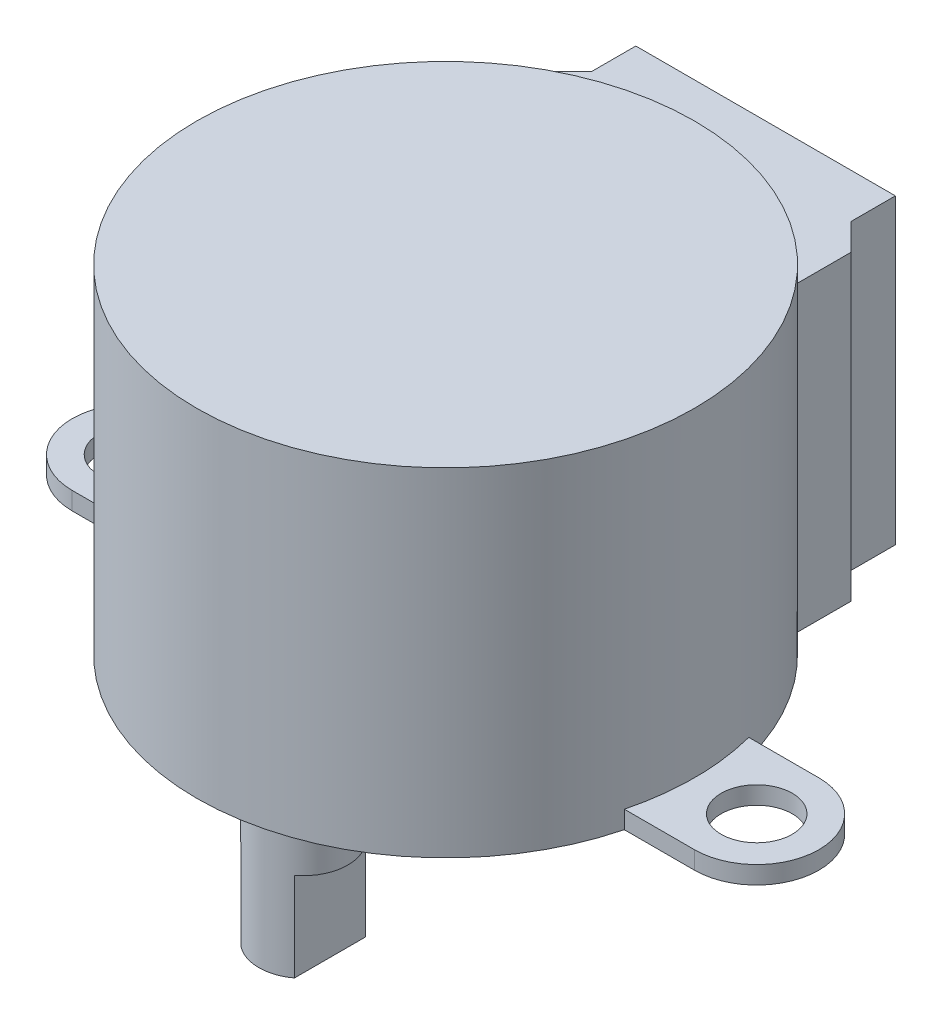
ISO-10303-21;
HEADER;
FILE_DESCRIPTION(('STEP AP214'),'2;1');
FILE_NAME('part.step','',(''),(''),'','','');
FILE_SCHEMA(('AUTOMOTIVE_DESIGN { 1 0 10303 214 1 1 1 1 }'));
ENDSEC;
DATA;
#1=APPLICATION_CONTEXT('core data for automotive mechanical design processes');
#2=APPLICATION_PROTOCOL_DEFINITION('international standard','automotive_design',2000,#1);
#3=PRODUCT_CONTEXT('',#1,'mechanical');
#4=PRODUCT('Part','Part','',(#3));
#5=PRODUCT_RELATED_PRODUCT_CATEGORY('part','',(#4));
#6=PRODUCT_DEFINITION_FORMATION('','',#4);
#7=PRODUCT_DEFINITION_CONTEXT('part definition',#1,'design');
#8=PRODUCT_DEFINITION('design','',#6,#7);
#9=PRODUCT_DEFINITION_SHAPE('','',#8);
#10=(LENGTH_UNIT() NAMED_UNIT(*) SI_UNIT(.MILLI.,.METRE.));
#11=(NAMED_UNIT(*) PLANE_ANGLE_UNIT() SI_UNIT($,.RADIAN.));
#12=(NAMED_UNIT(*) SI_UNIT($,.STERADIAN.) SOLID_ANGLE_UNIT());
#13=UNCERTAINTY_MEASURE_WITH_UNIT(LENGTH_MEASURE(1.E-05),#10,'distance_accuracy_value','');
#14=(GEOMETRIC_REPRESENTATION_CONTEXT(3) GLOBAL_UNCERTAINTY_ASSIGNED_CONTEXT((#13)) GLOBAL_UNIT_ASSIGNED_CONTEXT((#10,
#11,#12)) REPRESENTATION_CONTEXT('',''));
#15=CARTESIAN_POINT('',(0.,0.,0.));
#16=DIRECTION('',(0.,0.,1.));
#17=DIRECTION('',(1.,0.,0.));
#18=AXIS2_PLACEMENT_3D('',#15,#16,#17);
#19=CARTESIAN_POINT('',(0.,-10.,8.));
#20=DIRECTION('',(0.,-1.,0.));
#21=DIRECTION('',(0.,0.,-1.));
#22=AXIS2_PLACEMENT_3D('',#19,#20,#21);
#23=PLANE('',#22);
#24=DIRECTION('',(0.,0.,1.));
#25=VECTOR('',#24,1.);
#26=CARTESIAN_POINT('',(1.5,-10.,10.));
#27=LINE('',#26,#25);
#28=CARTESIAN_POINT('',(1.5,-10.,6.));
#29=VERTEX_POINT('',#28);
#30=CARTESIAN_POINT('',(1.5,-10.,10.));
#31=VERTEX_POINT('',#30);
#32=EDGE_CURVE('E125',#29,#31,#27,.T.);
#33=ORIENTED_EDGE('',*,*,#32,.T.);
#34=CARTESIAN_POINT('',(0.,-10.,8.));
#35=DIRECTION('',(0.,1.,0.));
#36=DIRECTION('',(0.,0.,1.));
#37=AXIS2_PLACEMENT_3D('',#34,#35,#36);
#38=CIRCLE('',#37,2.5);
#39=CARTESIAN_POINT('',(-1.5,-10.,10.));
#40=VERTEX_POINT('',#39);
#41=EDGE_CURVE('E133',#31,#40,#38,.F.);
#42=ORIENTED_EDGE('',*,*,#41,.T.);
#43=DIRECTION('',(0.,0.,-1.));
#44=VECTOR('',#43,1.);
#45=CARTESIAN_POINT('',(-1.5,-10.,10.));
#46=LINE('',#45,#44);
#47=CARTESIAN_POINT('',(-1.5,-10.,6.));
#48=VERTEX_POINT('',#47);
#49=EDGE_CURVE('E128',#40,#48,#46,.T.);
#50=ORIENTED_EDGE('',*,*,#49,.T.);
#51=CARTESIAN_POINT('',(0.,-10.,8.));
#52=DIRECTION('',(0.,1.,0.));
#53=DIRECTION('',(0.,0.,1.));
#54=AXIS2_PLACEMENT_3D('',#51,#52,#53);
#55=CIRCLE('',#54,2.5);
#56=EDGE_CURVE('E19',#48,#29,#55,.F.);
#57=ORIENTED_EDGE('',*,*,#56,.T.);
#58=EDGE_LOOP('',(#33,#42,#50,#57));
#59=FACE_BOUND('',#58,.T.);
#60=ADVANCED_FACE('F16',(#59),#23,.T.);
#61=CARTESIAN_POINT('',(0.,-5.,8.));
#62=DIRECTION('',(0.,-1.,0.));
#63=DIRECTION('',(0.,0.,-1.));
#64=AXIS2_PLACEMENT_3D('',#61,#62,#63);
#65=PLANE('',#64);
#66=CARTESIAN_POINT('',(0.,-5.,8.));
#67=DIRECTION('',(0.,1.,0.));
#68=DIRECTION('',(0.,0.,1.));
#69=AXIS2_PLACEMENT_3D('',#66,#67,#68);
#70=CIRCLE('',#69,2.5);
#71=CARTESIAN_POINT('',(-1.5,-5.,6.));
#72=VERTEX_POINT('',#71);
#73=CARTESIAN_POINT('',(-1.5,-5.,10.));
#74=VERTEX_POINT('',#73);
#75=EDGE_CURVE('E157',#72,#74,#70,.T.);
#76=ORIENTED_EDGE('',*,*,#75,.F.);
#77=DIRECTION('',(0.,0.,-1.));
#78=VECTOR('',#77,1.);
#79=CARTESIAN_POINT('',(-1.5,-5.,10.));
#80=LINE('',#79,#78);
#81=EDGE_CURVE('E158',#72,#74,#80,.F.);
#82=ORIENTED_EDGE('',*,*,#81,.T.);
#83=EDGE_LOOP('',(#76,#82));
#84=FACE_BOUND('',#83,.T.);
#85=ADVANCED_FACE('F224',(#84),#65,.T.);
#86=CARTESIAN_POINT('',(-1.5,-5.,10.));
#87=DIRECTION('',(1.,0.,0.));
#88=DIRECTION('',(0.,0.,-1.));
#89=AXIS2_PLACEMENT_3D('',#86,#87,#88);
#90=PLANE('',#89);
#91=DIRECTION('',(0.,1.,0.));
#92=VECTOR('',#91,1.);
#93=CARTESIAN_POINT('',(-1.5,-10.,10.));
#94=LINE('',#93,#92);
#95=EDGE_CURVE('E161',#74,#40,#94,.F.);
#96=ORIENTED_EDGE('',*,*,#95,.F.);
#97=ORIENTED_EDGE('',*,*,#81,.F.);
#98=DIRECTION('',(0.,1.,0.));
#99=VECTOR('',#98,1.);
#100=CARTESIAN_POINT('',(-1.5,-10.,6.));
#101=LINE('',#100,#99);
#102=EDGE_CURVE('E140',#48,#72,#101,.T.);
#103=ORIENTED_EDGE('',*,*,#102,.F.);
#104=ORIENTED_EDGE('',*,*,#49,.F.);
#105=EDGE_LOOP('',(#96,#97,#103,#104));
#106=FACE_BOUND('',#105,.T.);
#107=ADVANCED_FACE('F221',(#106),#90,.F.);
#108=CARTESIAN_POINT('',(0.,-5.,8.));
#109=DIRECTION('',(0.,-1.,0.));
#110=DIRECTION('',(0.,0.,-1.));
#111=AXIS2_PLACEMENT_3D('',#108,#109,#110);
#112=PLANE('',#111);
#113=CARTESIAN_POINT('',(0.,-5.,8.));
#114=DIRECTION('',(0.,1.,0.));
#115=DIRECTION('',(0.,0.,1.));
#116=AXIS2_PLACEMENT_3D('',#113,#114,#115);
#117=CIRCLE('',#116,2.5);
#118=CARTESIAN_POINT('',(1.5,-5.,10.));
#119=VERTEX_POINT('',#118);
#120=CARTESIAN_POINT('',(1.5,-5.,6.));
#121=VERTEX_POINT('',#120);
#122=EDGE_CURVE('E145',#119,#121,#117,.T.);
#123=ORIENTED_EDGE('',*,*,#122,.F.);
#124=DIRECTION('',(0.,0.,1.));
#125=VECTOR('',#124,1.);
#126=CARTESIAN_POINT('',(1.5,-5.,10.));
#127=LINE('',#126,#125);
#128=EDGE_CURVE('E141',#119,#121,#127,.F.);
#129=ORIENTED_EDGE('',*,*,#128,.T.);
#130=EDGE_LOOP('',(#123,#129));
#131=FACE_BOUND('',#130,.T.);
#132=ADVANCED_FACE('F231',(#131),#112,.T.);
#133=CARTESIAN_POINT('',(1.5,-5.,10.));
#134=DIRECTION('',(-1.,0.,0.));
#135=DIRECTION('',(0.,0.,1.));
#136=AXIS2_PLACEMENT_3D('',#133,#134,#135);
#137=PLANE('',#136);
#138=DIRECTION('',(0.,1.,0.));
#139=VECTOR('',#138,1.);
#140=CARTESIAN_POINT('',(1.5,-10.,6.));
#141=LINE('',#140,#139);
#142=EDGE_CURVE('E137',#121,#29,#141,.F.);
#143=ORIENTED_EDGE('',*,*,#142,.F.);
#144=ORIENTED_EDGE('',*,*,#128,.F.);
#145=DIRECTION('',(0.,1.,0.));
#146=VECTOR('',#145,1.);
#147=CARTESIAN_POINT('',(1.5,-10.,10.));
#148=LINE('',#147,#146);
#149=EDGE_CURVE('E139',#31,#119,#148,.T.);
#150=ORIENTED_EDGE('',*,*,#149,.F.);
#151=ORIENTED_EDGE('',*,*,#32,.F.);
#152=EDGE_LOOP('',(#143,#144,#150,#151));
#153=FACE_BOUND('',#152,.T.);
#154=ADVANCED_FACE('F136',(#153),#137,.F.);
#155=CARTESIAN_POINT('',(0.,-10.,8.));
#156=DIRECTION('',(0.,1.,0.));
#157=DIRECTION('',(0.,0.,1.));
#158=AXIS2_PLACEMENT_3D('',#155,#156,#157);
#159=CYLINDRICAL_SURFACE('',#158,2.5);
#160=CARTESIAN_POINT('',(0.,-1.6,8.));
#161=DIRECTION('',(0.,1.,0.));
#162=DIRECTION('',(0.,0.,1.));
#163=AXIS2_PLACEMENT_3D('',#160,#161,#162);
#164=CIRCLE('',#163,2.5);
#165=CARTESIAN_POINT('',(0.,-1.6,10.5));
#166=VERTEX_POINT('',#165);
#167=EDGE_CURVE('E147',#166,#166,#164,.T.);
#168=ORIENTED_EDGE('',*,*,#167,.F.);
#169=EDGE_LOOP('',(#168));
#170=FACE_BOUND('',#169,.T.);
#171=ORIENTED_EDGE('',*,*,#122,.T.);
#172=ORIENTED_EDGE('',*,*,#142,.T.);
#173=ORIENTED_EDGE('',*,*,#56,.F.);
#174=ORIENTED_EDGE('',*,*,#102,.T.);
#175=ORIENTED_EDGE('',*,*,#75,.T.);
#176=ORIENTED_EDGE('',*,*,#95,.T.);
#177=ORIENTED_EDGE('',*,*,#41,.F.);
#178=ORIENTED_EDGE('',*,*,#149,.T.);
#179=EDGE_LOOP('',(#171,#172,#173,#174,#175,#176,#177,#178));
#180=FACE_BOUND('',#179,.T.);
#181=ADVANCED_FACE('F143',(#170,#180),#159,.T.);
#182=CARTESIAN_POINT('',(0.,-1.6,8.));
#183=DIRECTION('',(0.,-1.,0.));
#184=DIRECTION('',(0.,0.,-1.));
#185=AXIS2_PLACEMENT_3D('',#182,#183,#184);
#186=PLANE('',#185);
#187=CARTESIAN_POINT('',(0.,-1.6,8.));
#188=DIRECTION('',(0.,1.,0.));
#189=DIRECTION('',(0.,0.,1.));
#190=AXIS2_PLACEMENT_3D('',#187,#188,#189);
#191=CIRCLE('',#190,4.);
#192=CARTESIAN_POINT('',(0.,-1.6,12.));
#193=VERTEX_POINT('',#192);
#194=EDGE_CURVE('E150',#193,#193,#191,.T.);
#195=ORIENTED_EDGE('',*,*,#194,.F.);
#196=EDGE_LOOP('',(#195));
#197=FACE_BOUND('',#196,.T.);
#198=ORIENTED_EDGE('',*,*,#167,.T.);
#199=EDGE_LOOP('',(#198));
#200=FACE_BOUND('',#199,.T.);
#201=ADVANCED_FACE('F326',(#197,#200),#186,.T.);
#202=CARTESIAN_POINT('',(0.,19.,0.));
#203=DIRECTION('',(0.,1.,0.));
#204=DIRECTION('',(0.,0.,1.));
#205=AXIS2_PLACEMENT_3D('',#202,#203,#204);
#206=PLANE('',#205);
#207=CARTESIAN_POINT('',(0.,19.,0.));
#208=DIRECTION('',(0.,-1.,0.));
#209=DIRECTION('',(0.,0.,-1.));
#210=AXIS2_PLACEMENT_3D('',#207,#208,#209);
#211=CIRCLE('',#210,14.);
#212=CARTESIAN_POINT('',(0.,19.,-14.));
#213=VERTEX_POINT('',#212);
#214=EDGE_CURVE('E201',#213,#213,#211,.T.);
#215=ORIENTED_EDGE('',*,*,#214,.F.);
#216=EDGE_LOOP('',(#215));
#217=FACE_BOUND('',#216,.T.);
#218=ADVANCED_FACE('F322',(#217),#206,.T.);
#219=CARTESIAN_POINT('',(0.,17.,0.));
#220=DIRECTION('',(0.,-1.,0.));
#221=DIRECTION('',(0.,0.,-1.));
#222=AXIS2_PLACEMENT_3D('',#219,#220,#221);
#223=PLANE('',#222);
#224=CARTESIAN_POINT('',(0.,17.,0.));
#225=DIRECTION('',(0.,-1.,0.));
#226=DIRECTION('',(0.,0.,-1.));
#227=AXIS2_PLACEMENT_3D('',#224,#225,#226);
#228=CIRCLE('',#227,14.);
#229=CARTESIAN_POINT('',(8.8,17.,-10.888526071053));
#230=VERTEX_POINT('',#229);
#231=CARTESIAN_POINT('',(-8.8,17.,-10.888526071053));
#232=VERTEX_POINT('',#231);
#233=EDGE_CURVE('E199',#230,#232,#228,.F.);
#234=ORIENTED_EDGE('',*,*,#233,.F.);
#235=DIRECTION('',(0.,0.,-1.));
#236=VECTOR('',#235,1.);
#237=CARTESIAN_POINT('',(8.8,17.,-7.74966331136752));
#238=LINE('',#237,#236);
#239=CARTESIAN_POINT('',(8.8,17.,-14.));
#240=VERTEX_POINT('',#239);
#241=EDGE_CURVE('E348',#240,#230,#238,.F.);
#242=ORIENTED_EDGE('',*,*,#241,.F.);
#243=DIRECTION('',(-0.707106781186549,0.,-0.707106781186546));
#244=VECTOR('',#243,1.);
#245=CARTESIAN_POINT('',(8.8,17.,-14.));
#246=LINE('',#245,#244);
#247=CARTESIAN_POINT('',(7.3,17.,-15.5));
#248=VERTEX_POINT('',#247);
#249=EDGE_CURVE('E351',#248,#240,#246,.F.);
#250=ORIENTED_EDGE('',*,*,#249,.F.);
#251=DIRECTION('',(0.,0.,-1.));
#252=VECTOR('',#251,1.);
#253=CARTESIAN_POINT('',(7.3,17.,-15.5));
#254=LINE('',#253,#252);
#255=CARTESIAN_POINT('',(7.3,17.,-18.));
#256=VERTEX_POINT('',#255);
#257=EDGE_CURVE('E360',#256,#248,#254,.F.);
#258=ORIENTED_EDGE('',*,*,#257,.F.);
#259=DIRECTION('',(-1.,0.,0.));
#260=VECTOR('',#259,1.);
#261=CARTESIAN_POINT('',(-7.3,17.,-18.));
#262=LINE('',#261,#260);
#263=CARTESIAN_POINT('',(-7.3,17.,-18.));
#264=VERTEX_POINT('',#263);
#265=EDGE_CURVE('E366',#264,#256,#262,.F.);
#266=ORIENTED_EDGE('',*,*,#265,.F.);
#267=DIRECTION('',(0.,0.,1.));
#268=VECTOR('',#267,1.);
#269=CARTESIAN_POINT('',(-7.3,17.,-15.5));
#270=LINE('',#269,#268);
#271=CARTESIAN_POINT('',(-7.3,17.,-15.5));
#272=VERTEX_POINT('',#271);
#273=EDGE_CURVE('E372',#272,#264,#270,.F.);
#274=ORIENTED_EDGE('',*,*,#273,.F.);
#275=DIRECTION('',(-0.707106781186549,0.,0.707106781186546));
#276=VECTOR('',#275,1.);
#277=CARTESIAN_POINT('',(-8.8,17.,-14.));
#278=LINE('',#277,#276);
#279=CARTESIAN_POINT('',(-8.8,17.,-14.));
#280=VERTEX_POINT('',#279);
#281=EDGE_CURVE('E378',#280,#272,#278,.F.);
#282=ORIENTED_EDGE('',*,*,#281,.F.);
#283=DIRECTION('',(0.,0.,1.));
#284=VECTOR('',#283,1.);
#285=CARTESIAN_POINT('',(-8.8,17.,-7.74966331136752));
#286=LINE('',#285,#284);
#287=EDGE_CURVE('E384',#232,#280,#286,.F.);
#288=ORIENTED_EDGE('',*,*,#287,.F.);
#289=EDGE_LOOP('',(#234,#242,#250,#258,#266,#274,#282,#288));
#290=FACE_BOUND('',#289,.T.);
#291=ADVANCED_FACE('F318',(#290),#223,.F.);
#292=CARTESIAN_POINT('',(-17.5,1.,0.));
#293=DIRECTION('',(0.,-1.,0.));
#294=DIRECTION('',(0.,0.,-1.));
#295=AXIS2_PLACEMENT_3D('',#292,#293,#294);
#296=PLANE('',#295);
#297=DIRECTION('',(1.,0.,0.));
#298=VECTOR('',#297,1.);
#299=CARTESIAN_POINT('',(-17.5,1.,3.5));
#300=LINE('',#299,#298);
#301=CARTESIAN_POINT('',(-13.555441711726,1.,3.5));
#302=VERTEX_POINT('',#301);
#303=CARTESIAN_POINT('',(-17.5,1.,3.5));
#304=VERTEX_POINT('',#303);
#305=EDGE_CURVE('E388',#302,#304,#300,.F.);
#306=ORIENTED_EDGE('',*,*,#305,.F.);
#307=CARTESIAN_POINT('',(0.,1.,0.));
#308=DIRECTION('',(0.,-1.,0.));
#309=DIRECTION('',(0.,0.,-1.));
#310=AXIS2_PLACEMENT_3D('',#307,#308,#309);
#311=CIRCLE('',#310,14.);
#312=CARTESIAN_POINT('',(-13.555441711726,1.,-3.5));
#313=VERTEX_POINT('',#312);
#314=EDGE_CURVE('E196',#313,#302,#311,.F.);
#315=ORIENTED_EDGE('',*,*,#314,.F.);
#316=DIRECTION('',(-1.,0.,0.));
#317=VECTOR('',#316,1.);
#318=CARTESIAN_POINT('',(-17.5,1.,-3.5));
#319=LINE('',#318,#317);
#320=CARTESIAN_POINT('',(-17.5,1.,-3.5));
#321=VERTEX_POINT('',#320);
#322=EDGE_CURVE('E216',#321,#313,#319,.F.);
#323=ORIENTED_EDGE('',*,*,#322,.F.);
#324=CARTESIAN_POINT('',(-17.5,1.,0.));
#325=DIRECTION('',(0.,-1.,0.));
#326=DIRECTION('',(0.,0.,-1.));
#327=AXIS2_PLACEMENT_3D('',#324,#325,#326);
#328=CIRCLE('',#327,3.5);
#329=EDGE_CURVE('E213',#304,#321,#328,.T.);
#330=ORIENTED_EDGE('',*,*,#329,.F.);
#331=EDGE_LOOP('',(#306,#315,#323,#330));
#332=FACE_BOUND('',#331,.T.);
#333=CARTESIAN_POINT('',(-17.5,1.,0.));
#334=DIRECTION('',(0.,-1.,0.));
#335=DIRECTION('',(0.,0.,-1.));
#336=AXIS2_PLACEMENT_3D('',#333,#334,#335);
#337=CIRCLE('',#336,2.);
#338=CARTESIAN_POINT('',(-17.5,1.,-2.));
#339=VERTEX_POINT('',#338);
#340=EDGE_CURVE('E192',#339,#339,#337,.T.);
#341=ORIENTED_EDGE('',*,*,#340,.T.);
#342=EDGE_LOOP('',(#341));
#343=FACE_BOUND('',#342,.T.);
#344=ADVANCED_FACE('F314',(#332,#343),#296,.F.);
#345=CARTESIAN_POINT('',(17.5,1.,0.));
#346=DIRECTION('',(0.,-1.,0.));
#347=DIRECTION('',(0.,0.,-1.));
#348=AXIS2_PLACEMENT_3D('',#345,#346,#347);
#349=PLANE('',#348);
#350=DIRECTION('',(-1.,0.,0.));
#351=VECTOR('',#350,1.);
#352=CARTESIAN_POINT('',(17.5,1.,-3.50000000000001));
#353=LINE('',#352,#351);
#354=CARTESIAN_POINT('',(13.555441711726,1.,-3.5));
#355=VERTEX_POINT('',#354);
#356=CARTESIAN_POINT('',(17.5,1.,-3.50000000000001));
#357=VERTEX_POINT('',#356);
#358=EDGE_CURVE('E343',#355,#357,#353,.F.);
#359=ORIENTED_EDGE('',*,*,#358,.F.);
#360=CARTESIAN_POINT('',(0.,1.,0.));
#361=DIRECTION('',(0.,-1.,0.));
#362=DIRECTION('',(0.,0.,-1.));
#363=AXIS2_PLACEMENT_3D('',#360,#361,#362);
#364=CIRCLE('',#363,14.);
#365=CARTESIAN_POINT('',(13.555441711726,1.,3.5));
#366=VERTEX_POINT('',#365);
#367=EDGE_CURVE('E205',#366,#355,#364,.F.);
#368=ORIENTED_EDGE('',*,*,#367,.F.);
#369=DIRECTION('',(1.,0.,0.));
#370=VECTOR('',#369,1.);
#371=CARTESIAN_POINT('',(17.5,1.,3.49999999999999));
#372=LINE('',#371,#370);
#373=CARTESIAN_POINT('',(17.5,1.,3.49999999999999));
#374=VERTEX_POINT('',#373);
#375=EDGE_CURVE('E212',#374,#366,#372,.F.);
#376=ORIENTED_EDGE('',*,*,#375,.F.);
#377=CARTESIAN_POINT('',(17.5,1.,0.));
#378=DIRECTION('',(0.,-1.,0.));
#379=DIRECTION('',(0.,0.,-1.));
#380=AXIS2_PLACEMENT_3D('',#377,#378,#379);
#381=CIRCLE('',#380,3.5);
#382=EDGE_CURVE('E209',#357,#374,#381,.T.);
#383=ORIENTED_EDGE('',*,*,#382,.F.);
#384=EDGE_LOOP('',(#359,#368,#376,#383));
#385=FACE_BOUND('',#384,.T.);
#386=CARTESIAN_POINT('',(17.5,1.,0.));
#387=DIRECTION('',(0.,-1.,0.));
#388=DIRECTION('',(0.,0.,-1.));
#389=AXIS2_PLACEMENT_3D('',#386,#387,#388);
#390=CIRCLE('',#389,2.);
#391=CARTESIAN_POINT('',(17.5,1.,-2.00000000000001));
#392=VERTEX_POINT('',#391);
#393=EDGE_CURVE('E189',#392,#392,#390,.T.);
#394=ORIENTED_EDGE('',*,*,#393,.T.);
#395=EDGE_LOOP('',(#394));
#396=FACE_BOUND('',#395,.T.);
#397=ADVANCED_FACE('F310',(#385,#396),#349,.F.);
#398=CARTESIAN_POINT('',(0.,-1.6,8.));
#399=DIRECTION('',(0.,1.,0.));
#400=DIRECTION('',(0.,0.,1.));
#401=AXIS2_PLACEMENT_3D('',#398,#399,#400);
#402=CYLINDRICAL_SURFACE('',#401,4.);
#403=ORIENTED_EDGE('',*,*,#194,.T.);
#404=EDGE_LOOP('',(#403));
#405=FACE_BOUND('',#404,.T.);
#406=CARTESIAN_POINT('',(0.,0.,8.));
#407=DIRECTION('',(0.,1.,0.));
#408=DIRECTION('',(0.,0.,1.));
#409=AXIS2_PLACEMENT_3D('',#406,#407,#408);
#410=CIRCLE('',#409,4.);
#411=CARTESIAN_POINT('',(0.,0.,12.));
#412=VERTEX_POINT('',#411);
#413=EDGE_CURVE('E186',#412,#412,#410,.F.);
#414=ORIENTED_EDGE('',*,*,#413,.T.);
#415=EDGE_LOOP('',(#414));
#416=FACE_BOUND('',#415,.T.);
#417=ADVANCED_FACE('F306',(#405,#416),#402,.T.);
#418=CARTESIAN_POINT('',(-17.5,1.,-3.5));
#419=DIRECTION('',(0.,0.,-1.));
#420=DIRECTION('',(-1.,0.,0.));
#421=AXIS2_PLACEMENT_3D('',#418,#419,#420);
#422=PLANE('',#421);
#423=ORIENTED_EDGE('',*,*,#322,.T.);
#424=DIRECTION('',(0.,-1.,0.));
#425=VECTOR('',#424,1.);
#426=CARTESIAN_POINT('',(-13.555441711726,19.,-3.5));
#427=LINE('',#426,#425);
#428=CARTESIAN_POINT('',(-13.555441711726,0.,-3.5));
#429=VERTEX_POINT('',#428);
#430=EDGE_CURVE('E198',#429,#313,#427,.F.);
#431=ORIENTED_EDGE('',*,*,#430,.F.);
#432=DIRECTION('',(1.,0.,0.));
#433=VECTOR('',#432,1.);
#434=CARTESIAN_POINT('',(0.,0.,-3.5));
#435=LINE('',#434,#433);
#436=CARTESIAN_POINT('',(-17.5,0.,-3.5));
#437=VERTEX_POINT('',#436);
#438=EDGE_CURVE('E185',#429,#437,#435,.F.);
#439=ORIENTED_EDGE('',*,*,#438,.T.);
#440=DIRECTION('',(0.,-1.,0.));
#441=VECTOR('',#440,1.);
#442=CARTESIAN_POINT('',(-17.5,1.,-3.5));
#443=LINE('',#442,#441);
#444=EDGE_CURVE('E215',#321,#437,#443,.T.);
#445=ORIENTED_EDGE('',*,*,#444,.F.);
#446=EDGE_LOOP('',(#423,#431,#439,#445));
#447=FACE_BOUND('',#446,.T.);
#448=ADVANCED_FACE('F302',(#447),#422,.T.);
#449=CARTESIAN_POINT('',(-17.5,1.,0.));
#450=DIRECTION('',(0.,-1.,0.));
#451=DIRECTION('',(0.,0.,-1.));
#452=AXIS2_PLACEMENT_3D('',#449,#450,#451);
#453=CYLINDRICAL_SURFACE('',#452,3.5);
#454=ORIENTED_EDGE('',*,*,#329,.T.);
#455=ORIENTED_EDGE('',*,*,#444,.T.);
#456=CARTESIAN_POINT('',(-17.5,0.,0.));
#457=DIRECTION('',(0.,-1.,0.));
#458=DIRECTION('',(0.,0.,-1.));
#459=AXIS2_PLACEMENT_3D('',#456,#457,#458);
#460=CIRCLE('',#459,3.5);
#461=CARTESIAN_POINT('',(-17.5,0.,3.5));
#462=VERTEX_POINT('',#461);
#463=EDGE_CURVE('E182',#437,#462,#460,.F.);
#464=ORIENTED_EDGE('',*,*,#463,.T.);
#465=DIRECTION('',(0.,1.,0.));
#466=VECTOR('',#465,1.);
#467=CARTESIAN_POINT('',(-17.5,1.,3.5));
#468=LINE('',#467,#466);
#469=EDGE_CURVE('E342',#304,#462,#468,.F.);
#470=ORIENTED_EDGE('',*,*,#469,.F.);
#471=EDGE_LOOP('',(#454,#455,#464,#470));
#472=FACE_BOUND('',#471,.T.);
#473=ADVANCED_FACE('F298',(#472),#453,.T.);
#474=CARTESIAN_POINT('',(-17.5,1.,3.5));
#475=DIRECTION('',(0.,0.,1.));
#476=DIRECTION('',(1.,0.,0.));
#477=AXIS2_PLACEMENT_3D('',#474,#475,#476);
#478=PLANE('',#477);
#479=ORIENTED_EDGE('',*,*,#305,.T.);
#480=ORIENTED_EDGE('',*,*,#469,.T.);
#481=DIRECTION('',(1.,0.,0.));
#482=VECTOR('',#481,1.);
#483=CARTESIAN_POINT('',(0.,0.,3.5));
#484=LINE('',#483,#482);
#485=CARTESIAN_POINT('',(-13.555441711726,0.,3.5));
#486=VERTEX_POINT('',#485);
#487=EDGE_CURVE('E181',#462,#486,#484,.T.);
#488=ORIENTED_EDGE('',*,*,#487,.T.);
#489=DIRECTION('',(0.,-1.,0.));
#490=VECTOR('',#489,1.);
#491=CARTESIAN_POINT('',(-13.555441711726,19.,3.5));
#492=LINE('',#491,#490);
#493=EDGE_CURVE('E195',#302,#486,#492,.T.);
#494=ORIENTED_EDGE('',*,*,#493,.F.);
#495=EDGE_LOOP('',(#479,#480,#488,#494));
#496=FACE_BOUND('',#495,.T.);
#497=ADVANCED_FACE('F294',(#496),#478,.T.);
#498=CARTESIAN_POINT('',(17.5,1.,3.49999999999999));
#499=DIRECTION('',(0.,0.,1.));
#500=DIRECTION('',(1.,0.,0.));
#501=AXIS2_PLACEMENT_3D('',#498,#499,#500);
#502=PLANE('',#501);
#503=ORIENTED_EDGE('',*,*,#375,.T.);
#504=DIRECTION('',(0.,-1.,0.));
#505=VECTOR('',#504,1.);
#506=CARTESIAN_POINT('',(13.555441711726,19.,3.5));
#507=LINE('',#506,#505);
#508=CARTESIAN_POINT('',(13.555441711726,0.,3.5));
#509=VERTEX_POINT('',#508);
#510=EDGE_CURVE('E208',#509,#366,#507,.F.);
#511=ORIENTED_EDGE('',*,*,#510,.F.);
#512=DIRECTION('',(1.,0.,0.));
#513=VECTOR('',#512,1.);
#514=CARTESIAN_POINT('',(0.,0.,3.5));
#515=LINE('',#514,#513);
#516=CARTESIAN_POINT('',(17.5,0.,3.5));
#517=VERTEX_POINT('',#516);
#518=EDGE_CURVE('E178',#509,#517,#515,.T.);
#519=ORIENTED_EDGE('',*,*,#518,.T.);
#520=DIRECTION('',(0.,-1.,0.));
#521=VECTOR('',#520,1.);
#522=CARTESIAN_POINT('',(17.5,1.,3.49999999999999));
#523=LINE('',#522,#521);
#524=EDGE_CURVE('E211',#374,#517,#523,.T.);
#525=ORIENTED_EDGE('',*,*,#524,.F.);
#526=EDGE_LOOP('',(#503,#511,#519,#525));
#527=FACE_BOUND('',#526,.T.);
#528=ADVANCED_FACE('F290',(#527),#502,.T.);
#529=CARTESIAN_POINT('',(17.5,1.,0.));
#530=DIRECTION('',(0.,-1.,0.));
#531=DIRECTION('',(0.,0.,-1.));
#532=AXIS2_PLACEMENT_3D('',#529,#530,#531);
#533=CYLINDRICAL_SURFACE('',#532,3.5);
#534=ORIENTED_EDGE('',*,*,#382,.T.);
#535=ORIENTED_EDGE('',*,*,#524,.T.);
#536=CARTESIAN_POINT('',(17.5,0.,0.));
#537=DIRECTION('',(0.,-1.,0.));
#538=DIRECTION('',(0.,0.,-1.));
#539=AXIS2_PLACEMENT_3D('',#536,#537,#538);
#540=CIRCLE('',#539,3.5);
#541=CARTESIAN_POINT('',(17.5,0.,-3.50000000000001));
#542=VERTEX_POINT('',#541);
#543=EDGE_CURVE('E175',#517,#542,#540,.F.);
#544=ORIENTED_EDGE('',*,*,#543,.T.);
#545=DIRECTION('',(0.,1.,0.));
#546=VECTOR('',#545,1.);
#547=CARTESIAN_POINT('',(17.5,1.,-3.50000000000001));
#548=LINE('',#547,#546);
#549=EDGE_CURVE('E345',#357,#542,#548,.F.);
#550=ORIENTED_EDGE('',*,*,#549,.F.);
#551=EDGE_LOOP('',(#534,#535,#544,#550));
#552=FACE_BOUND('',#551,.T.);
#553=ADVANCED_FACE('F286',(#552),#533,.T.);
#554=CARTESIAN_POINT('',(17.5,1.,-3.50000000000001));
#555=DIRECTION('',(0.,0.,-1.));
#556=DIRECTION('',(-1.,0.,0.));
#557=AXIS2_PLACEMENT_3D('',#554,#555,#556);
#558=PLANE('',#557);
#559=ORIENTED_EDGE('',*,*,#358,.T.);
#560=ORIENTED_EDGE('',*,*,#549,.T.);
#561=DIRECTION('',(1.,0.,0.));
#562=VECTOR('',#561,1.);
#563=CARTESIAN_POINT('',(0.,0.,-3.50000000000001));
#564=LINE('',#563,#562);
#565=CARTESIAN_POINT('',(13.555441711726,0.,-3.5));
#566=VERTEX_POINT('',#565);
#567=EDGE_CURVE('E174',#542,#566,#564,.F.);
#568=ORIENTED_EDGE('',*,*,#567,.T.);
#569=DIRECTION('',(0.,-1.,0.));
#570=VECTOR('',#569,1.);
#571=CARTESIAN_POINT('',(13.555441711726,19.,-3.5));
#572=LINE('',#571,#570);
#573=EDGE_CURVE('E207',#355,#566,#572,.T.);
#574=ORIENTED_EDGE('',*,*,#573,.F.);
#575=EDGE_LOOP('',(#559,#560,#568,#574));
#576=FACE_BOUND('',#575,.T.);
#577=ADVANCED_FACE('F282',(#576),#558,.T.);
#578=CARTESIAN_POINT('',(8.8,17.,-7.74966331136752));
#579=DIRECTION('',(1.,0.,0.));
#580=DIRECTION('',(0.,0.,-1.));
#581=AXIS2_PLACEMENT_3D('',#578,#579,#580);
#582=PLANE('',#581);
#583=DIRECTION('',(0.,1.,0.));
#584=VECTOR('',#583,1.);
#585=CARTESIAN_POINT('',(8.8,17.,-14.));
#586=LINE('',#585,#584);
#587=CARTESIAN_POINT('',(8.8,0.,-14.));
#588=VERTEX_POINT('',#587);
#589=EDGE_CURVE('E357',#240,#588,#586,.F.);
#590=ORIENTED_EDGE('',*,*,#589,.F.);
#591=ORIENTED_EDGE('',*,*,#241,.T.);
#592=DIRECTION('',(0.,1.,0.));
#593=VECTOR('',#592,1.);
#594=CARTESIAN_POINT('',(8.8,17.,-10.888526071053));
#595=LINE('',#594,#593);
#596=CARTESIAN_POINT('',(8.8,0.,-10.888526071053));
#597=VERTEX_POINT('',#596);
#598=EDGE_CURVE('E352',#230,#597,#595,.F.);
#599=ORIENTED_EDGE('',*,*,#598,.T.);
#600=DIRECTION('',(0.,0.,1.));
#601=VECTOR('',#600,1.);
#602=CARTESIAN_POINT('',(8.8,0.,0.));
#603=LINE('',#602,#601);
#604=EDGE_CURVE('E173',#597,#588,#603,.F.);
#605=ORIENTED_EDGE('',*,*,#604,.T.);
#606=EDGE_LOOP('',(#590,#591,#599,#605));
#607=FACE_BOUND('',#606,.T.);
#608=ADVANCED_FACE('F278',(#607),#582,.T.);
#609=CARTESIAN_POINT('',(8.8,17.,-14.));
#610=DIRECTION('',(0.707106781186546,0.,-0.707106781186549));
#611=DIRECTION('',(-0.707106781186549,0.,-0.707106781186546));
#612=AXIS2_PLACEMENT_3D('',#609,#610,#611);
#613=PLANE('',#612);
#614=ORIENTED_EDGE('',*,*,#249,.T.);
#615=ORIENTED_EDGE('',*,*,#589,.T.);
#616=DIRECTION('',(-0.707106781186549,0.,-0.707106781186546));
#617=VECTOR('',#616,1.);
#618=CARTESIAN_POINT('',(8.8,0.,-14.));
#619=LINE('',#618,#617);
#620=CARTESIAN_POINT('',(7.3,0.,-15.5));
#621=VERTEX_POINT('',#620);
#622=EDGE_CURVE('E405',#588,#621,#619,.T.);
#623=ORIENTED_EDGE('',*,*,#622,.T.);
#624=DIRECTION('',(0.,1.,0.));
#625=VECTOR('',#624,1.);
#626=CARTESIAN_POINT('',(7.3,17.,-15.5));
#627=LINE('',#626,#625);
#628=EDGE_CURVE('E363',#248,#621,#627,.F.);
#629=ORIENTED_EDGE('',*,*,#628,.F.);
#630=EDGE_LOOP('',(#614,#615,#623,#629));
#631=FACE_BOUND('',#630,.T.);
#632=ADVANCED_FACE('F274',(#631),#613,.T.);
#633=CARTESIAN_POINT('',(7.3,17.,-15.5));
#634=DIRECTION('',(1.,0.,0.));
#635=DIRECTION('',(0.,0.,-1.));
#636=AXIS2_PLACEMENT_3D('',#633,#634,#635);
#637=PLANE('',#636);
#638=ORIENTED_EDGE('',*,*,#257,.T.);
#639=ORIENTED_EDGE('',*,*,#628,.T.);
#640=DIRECTION('',(0.,0.,1.));
#641=VECTOR('',#640,1.);
#642=CARTESIAN_POINT('',(7.3,0.,0.));
#643=LINE('',#642,#641);
#644=CARTESIAN_POINT('',(7.3,0.,-18.));
#645=VERTEX_POINT('',#644);
#646=EDGE_CURVE('E408',#621,#645,#643,.F.);
#647=ORIENTED_EDGE('',*,*,#646,.T.);
#648=DIRECTION('',(0.,1.,0.));
#649=VECTOR('',#648,1.);
#650=CARTESIAN_POINT('',(7.3,17.,-18.));
#651=LINE('',#650,#649);
#652=EDGE_CURVE('E369',#256,#645,#651,.F.);
#653=ORIENTED_EDGE('',*,*,#652,.F.);
#654=EDGE_LOOP('',(#638,#639,#647,#653));
#655=FACE_BOUND('',#654,.T.);
#656=ADVANCED_FACE('F270',(#655),#637,.T.);
#657=CARTESIAN_POINT('',(-7.3,17.,-18.));
#658=DIRECTION('',(0.,0.,-1.));
#659=DIRECTION('',(-1.,0.,0.));
#660=AXIS2_PLACEMENT_3D('',#657,#658,#659);
#661=PLANE('',#660);
#662=ORIENTED_EDGE('',*,*,#265,.T.);
#663=ORIENTED_EDGE('',*,*,#652,.T.);
#664=DIRECTION('',(1.,0.,0.));
#665=VECTOR('',#664,1.);
#666=CARTESIAN_POINT('',(0.,0.,-18.));
#667=LINE('',#666,#665);
#668=CARTESIAN_POINT('',(-7.3,0.,-18.));
#669=VERTEX_POINT('',#668);
#670=EDGE_CURVE('E417',#645,#669,#667,.F.);
#671=ORIENTED_EDGE('',*,*,#670,.T.);
#672=DIRECTION('',(0.,1.,0.));
#673=VECTOR('',#672,1.);
#674=CARTESIAN_POINT('',(-7.3,17.,-18.));
#675=LINE('',#674,#673);
#676=EDGE_CURVE('E375',#264,#669,#675,.F.);
#677=ORIENTED_EDGE('',*,*,#676,.F.);
#678=EDGE_LOOP('',(#662,#663,#671,#677));
#679=FACE_BOUND('',#678,.T.);
#680=ADVANCED_FACE('F266',(#679),#661,.T.);
#681=CARTESIAN_POINT('',(-7.3,17.,-15.5));
#682=DIRECTION('',(-1.,0.,0.));
#683=DIRECTION('',(0.,0.,1.));
#684=AXIS2_PLACEMENT_3D('',#681,#682,#683);
#685=PLANE('',#684);
#686=ORIENTED_EDGE('',*,*,#273,.T.);
#687=ORIENTED_EDGE('',*,*,#676,.T.);
#688=DIRECTION('',(0.,0.,1.));
#689=VECTOR('',#688,1.);
#690=CARTESIAN_POINT('',(-7.3,0.,0.));
#691=LINE('',#690,#689);
#692=CARTESIAN_POINT('',(-7.3,0.,-15.5));
#693=VERTEX_POINT('',#692);
#694=EDGE_CURVE('E426',#669,#693,#691,.T.);
#695=ORIENTED_EDGE('',*,*,#694,.T.);
#696=DIRECTION('',(0.,1.,0.));
#697=VECTOR('',#696,1.);
#698=CARTESIAN_POINT('',(-7.3,17.,-15.5));
#699=LINE('',#698,#697);
#700=EDGE_CURVE('E381',#272,#693,#699,.F.);
#701=ORIENTED_EDGE('',*,*,#700,.F.);
#702=EDGE_LOOP('',(#686,#687,#695,#701));
#703=FACE_BOUND('',#702,.T.);
#704=ADVANCED_FACE('F262',(#703),#685,.T.);
#705=CARTESIAN_POINT('',(-8.8,17.,-14.));
#706=DIRECTION('',(-0.707106781186546,0.,-0.707106781186549));
#707=DIRECTION('',(-0.707106781186549,0.,0.707106781186546));
#708=AXIS2_PLACEMENT_3D('',#705,#706,#707);
#709=PLANE('',#708);
#710=ORIENTED_EDGE('',*,*,#281,.T.);
#711=ORIENTED_EDGE('',*,*,#700,.T.);
#712=DIRECTION('',(-0.707106781186549,0.,0.707106781186546));
#713=VECTOR('',#712,1.);
#714=CARTESIAN_POINT('',(-7.3,0.,-15.5));
#715=LINE('',#714,#713);
#716=CARTESIAN_POINT('',(-8.8,0.,-14.));
#717=VERTEX_POINT('',#716);
#718=EDGE_CURVE('E435',#693,#717,#715,.T.);
#719=ORIENTED_EDGE('',*,*,#718,.T.);
#720=DIRECTION('',(0.,1.,0.));
#721=VECTOR('',#720,1.);
#722=CARTESIAN_POINT('',(-8.8,17.,-14.));
#723=LINE('',#722,#721);
#724=EDGE_CURVE('E204',#280,#717,#723,.F.);
#725=ORIENTED_EDGE('',*,*,#724,.F.);
#726=EDGE_LOOP('',(#710,#711,#719,#725));
#727=FACE_BOUND('',#726,.T.);
#728=ADVANCED_FACE('F258',(#727),#709,.T.);
#729=CARTESIAN_POINT('',(-8.8,17.,-7.74966331136752));
#730=DIRECTION('',(-1.,0.,0.));
#731=DIRECTION('',(0.,0.,1.));
#732=AXIS2_PLACEMENT_3D('',#729,#730,#731);
#733=PLANE('',#732);
#734=ORIENTED_EDGE('',*,*,#724,.T.);
#735=DIRECTION('',(0.,0.,1.));
#736=VECTOR('',#735,1.);
#737=CARTESIAN_POINT('',(-8.8,0.,0.));
#738=LINE('',#737,#736);
#739=CARTESIAN_POINT('',(-8.8,0.,-10.888526071053));
#740=VERTEX_POINT('',#739);
#741=EDGE_CURVE('E169',#717,#740,#738,.T.);
#742=ORIENTED_EDGE('',*,*,#741,.T.);
#743=DIRECTION('',(0.,-1.,0.));
#744=VECTOR('',#743,1.);
#745=CARTESIAN_POINT('',(-8.8,19.,-10.888526071053));
#746=LINE('',#745,#744);
#747=EDGE_CURVE('E34',#232,#740,#746,.T.);
#748=ORIENTED_EDGE('',*,*,#747,.F.);
#749=ORIENTED_EDGE('',*,*,#287,.T.);
#750=EDGE_LOOP('',(#734,#742,#748,#749));
#751=FACE_BOUND('',#750,.T.);
#752=ADVANCED_FACE('F254',(#751),#733,.T.);
#753=CARTESIAN_POINT('',(0.,19.,0.));
#754=DIRECTION('',(0.,-1.,0.));
#755=DIRECTION('',(0.,0.,-1.));
#756=AXIS2_PLACEMENT_3D('',#753,#754,#755);
#757=CYLINDRICAL_SURFACE('',#756,14.);
#758=ORIENTED_EDGE('',*,*,#214,.T.);
#759=EDGE_LOOP('',(#758));
#760=FACE_BOUND('',#759,.T.);
#761=ORIENTED_EDGE('',*,*,#493,.T.);
#762=CARTESIAN_POINT('',(0.,0.,0.));
#763=DIRECTION('',(0.,-1.,0.));
#764=DIRECTION('',(0.,0.,-1.));
#765=AXIS2_PLACEMENT_3D('',#762,#763,#764);
#766=CIRCLE('',#765,14.);
#767=EDGE_CURVE('E179',#486,#509,#766,.F.);
#768=ORIENTED_EDGE('',*,*,#767,.T.);
#769=ORIENTED_EDGE('',*,*,#510,.T.);
#770=ORIENTED_EDGE('',*,*,#367,.T.);
#771=ORIENTED_EDGE('',*,*,#573,.T.);
#772=CARTESIAN_POINT('',(0.,0.,0.));
#773=DIRECTION('',(0.,-1.,0.));
#774=DIRECTION('',(0.,0.,-1.));
#775=AXIS2_PLACEMENT_3D('',#772,#773,#774);
#776=CIRCLE('',#775,14.);
#777=EDGE_CURVE('E170',#566,#597,#776,.F.);
#778=ORIENTED_EDGE('',*,*,#777,.T.);
#779=ORIENTED_EDGE('',*,*,#598,.F.);
#780=ORIENTED_EDGE('',*,*,#233,.T.);
#781=ORIENTED_EDGE('',*,*,#747,.T.);
#782=CARTESIAN_POINT('',(0.,0.,0.));
#783=DIRECTION('',(0.,-1.,0.));
#784=DIRECTION('',(0.,0.,-1.));
#785=AXIS2_PLACEMENT_3D('',#782,#783,#784);
#786=CIRCLE('',#785,14.);
#787=EDGE_CURVE('E167',#740,#429,#786,.F.);
#788=ORIENTED_EDGE('',*,*,#787,.T.);
#789=ORIENTED_EDGE('',*,*,#430,.T.);
#790=ORIENTED_EDGE('',*,*,#314,.T.);
#791=EDGE_LOOP('',(#761,#768,#769,#770,#771,#778,#779,#780,#781,#788,#789,#790));
#792=FACE_BOUND('',#791,.T.);
#793=ADVANCED_FACE('F250',(#760,#792),#757,.T.);
#794=CARTESIAN_POINT('',(-17.5,1.,0.));
#795=DIRECTION('',(0.,-1.,0.));
#796=DIRECTION('',(0.,0.,-1.));
#797=AXIS2_PLACEMENT_3D('',#794,#795,#796);
#798=CYLINDRICAL_SURFACE('',#797,2.);
#799=ORIENTED_EDGE('',*,*,#340,.F.);
#800=EDGE_LOOP('',(#799));
#801=FACE_BOUND('',#800,.T.);
#802=CARTESIAN_POINT('',(-17.5,0.,0.));
#803=DIRECTION('',(0.,-1.,0.));
#804=DIRECTION('',(0.,0.,-1.));
#805=AXIS2_PLACEMENT_3D('',#802,#803,#804);
#806=CIRCLE('',#805,2.);
#807=CARTESIAN_POINT('',(-17.5,0.,-2.));
#808=VERTEX_POINT('',#807);
#809=EDGE_CURVE('E25',#808,#808,#806,.T.);
#810=ORIENTED_EDGE('',*,*,#809,.T.);
#811=EDGE_LOOP('',(#810));
#812=FACE_BOUND('',#811,.T.);
#813=ADVANCED_FACE('F242',(#801,#812),#798,.F.);
#814=CARTESIAN_POINT('',(17.5,1.,0.));
#815=DIRECTION('',(0.,-1.,0.));
#816=DIRECTION('',(0.,0.,-1.));
#817=AXIS2_PLACEMENT_3D('',#814,#815,#816);
#818=CYLINDRICAL_SURFACE('',#817,2.);
#819=ORIENTED_EDGE('',*,*,#393,.F.);
#820=EDGE_LOOP('',(#819));
#821=FACE_BOUND('',#820,.T.);
#822=CARTESIAN_POINT('',(17.5,0.,0.));
#823=DIRECTION('',(0.,-1.,0.));
#824=DIRECTION('',(0.,0.,-1.));
#825=AXIS2_PLACEMENT_3D('',#822,#823,#824);
#826=CIRCLE('',#825,2.);
#827=CARTESIAN_POINT('',(17.5,0.,-2.00000000000001));
#828=VERTEX_POINT('',#827);
#829=EDGE_CURVE('E10',#828,#828,#826,.T.);
#830=ORIENTED_EDGE('',*,*,#829,.T.);
#831=EDGE_LOOP('',(#830));
#832=FACE_BOUND('',#831,.T.);
#833=ADVANCED_FACE('F236',(#821,#832),#818,.F.);
#834=CARTESIAN_POINT('',(0.,0.,0.));
#835=DIRECTION('',(0.,1.,0.));
#836=DIRECTION('',(0.,0.,1.));
#837=AXIS2_PLACEMENT_3D('',#834,#835,#836);
#838=PLANE('',#837);
#839=ORIENTED_EDGE('',*,*,#829,.F.);
#840=EDGE_LOOP('',(#839));
#841=FACE_BOUND('',#840,.T.);
#842=ORIENTED_EDGE('',*,*,#809,.F.);
#843=EDGE_LOOP('',(#842));
#844=FACE_BOUND('',#843,.T.);
#845=ORIENTED_EDGE('',*,*,#741,.F.);
#846=ORIENTED_EDGE('',*,*,#718,.F.);
#847=ORIENTED_EDGE('',*,*,#694,.F.);
#848=ORIENTED_EDGE('',*,*,#670,.F.);
#849=ORIENTED_EDGE('',*,*,#646,.F.);
#850=ORIENTED_EDGE('',*,*,#622,.F.);
#851=ORIENTED_EDGE('',*,*,#604,.F.);
#852=ORIENTED_EDGE('',*,*,#777,.F.);
#853=ORIENTED_EDGE('',*,*,#567,.F.);
#854=ORIENTED_EDGE('',*,*,#543,.F.);
#855=ORIENTED_EDGE('',*,*,#518,.F.);
#856=ORIENTED_EDGE('',*,*,#767,.F.);
#857=ORIENTED_EDGE('',*,*,#487,.F.);
#858=ORIENTED_EDGE('',*,*,#463,.F.);
#859=ORIENTED_EDGE('',*,*,#438,.F.);
#860=ORIENTED_EDGE('',*,*,#787,.F.);
#861=EDGE_LOOP('',(#845,#846,#847,#848,#849,#850,#851,#852,#853,#854,#855,#856,#857,#858,#859,#860));
#862=FACE_BOUND('',#861,.T.);
#863=ORIENTED_EDGE('',*,*,#413,.F.);
#864=EDGE_LOOP('',(#863));
#865=FACE_BOUND('',#864,.T.);
#866=ADVANCED_FACE('F234',(#841,#844,#862,#865),#838,.F.);
#867=CLOSED_SHELL('',(#60,#85,#107,#132,#154,#181,#201,#218,#291,#344,#397,#417,#448,#473,#497,
#528,#553,#577,#608,#632,#656,#680,#704,#728,#752,#793,#813,#833,#866));
#868=MANIFOLD_SOLID_BREP('B1',#867);
#869=ADVANCED_BREP_SHAPE_REPRESENTATION('',(#18,#868),#14);
#870=SHAPE_DEFINITION_REPRESENTATION(#9,#869);
ENDSEC;
END-ISO-10303-21;
